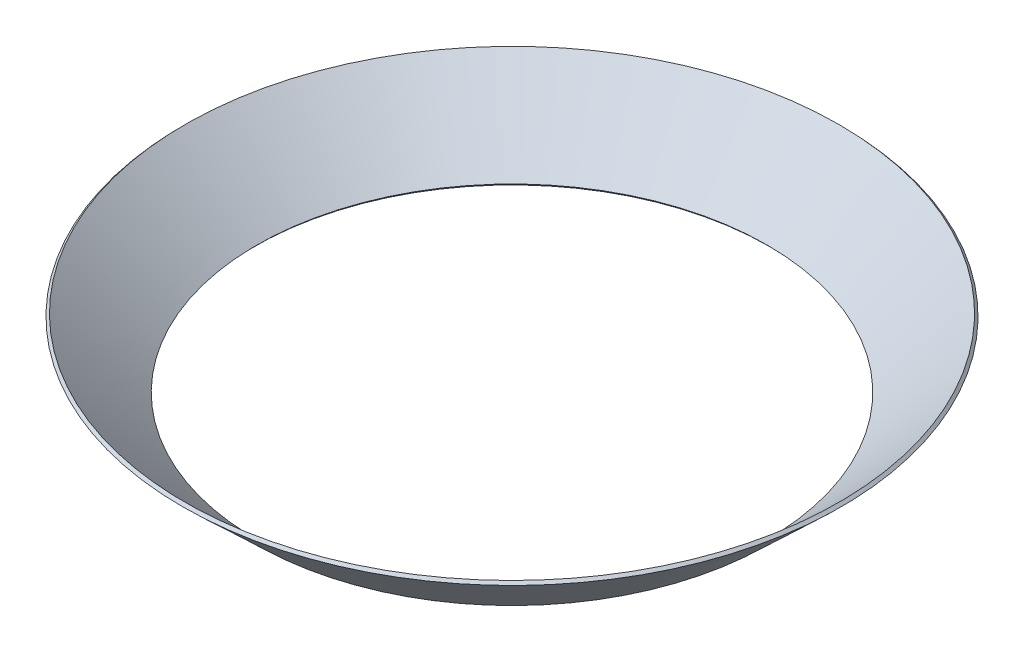
ISO-10303-21;
HEADER;
FILE_DESCRIPTION(('STEP AP214'),'2;1');
FILE_NAME('part.step','',(''),(''),'','','');
FILE_SCHEMA(('AUTOMOTIVE_DESIGN { 1 0 10303 214 1 1 1 1 }'));
ENDSEC;
DATA;
#1=APPLICATION_CONTEXT('core data for automotive mechanical design processes');
#2=APPLICATION_PROTOCOL_DEFINITION('international standard','automotive_design',2000,#1);
#3=PRODUCT_CONTEXT('',#1,'mechanical');
#4=PRODUCT('Part','Part','',(#3));
#5=PRODUCT_RELATED_PRODUCT_CATEGORY('part','',(#4));
#6=PRODUCT_DEFINITION_FORMATION('','',#4);
#7=PRODUCT_DEFINITION_CONTEXT('part definition',#1,'design');
#8=PRODUCT_DEFINITION('design','',#6,#7);
#9=PRODUCT_DEFINITION_SHAPE('','',#8);
#10=(LENGTH_UNIT() NAMED_UNIT(*) SI_UNIT(.MILLI.,.METRE.));
#11=(NAMED_UNIT(*) PLANE_ANGLE_UNIT() SI_UNIT($,.RADIAN.));
#12=(NAMED_UNIT(*) SI_UNIT($,.STERADIAN.) SOLID_ANGLE_UNIT());
#13=UNCERTAINTY_MEASURE_WITH_UNIT(LENGTH_MEASURE(1.E-05),#10,'distance_accuracy_value','');
#14=(GEOMETRIC_REPRESENTATION_CONTEXT(3) GLOBAL_UNCERTAINTY_ASSIGNED_CONTEXT((#13)) GLOBAL_UNIT_ASSIGNED_CONTEXT((#10,
#11,#12)) REPRESENTATION_CONTEXT('',''));
#15=CARTESIAN_POINT('',(0.,0.,0.));
#16=DIRECTION('',(0.,0.,1.));
#17=DIRECTION('',(1.,0.,0.));
#18=AXIS2_PLACEMENT_3D('',#15,#16,#17);
#19=CARTESIAN_POINT('',(0.,309.426421450919,1.08035657624089E-12));
#20=DIRECTION('',(0.,1.,0.));
#21=DIRECTION('',(0.,0.,1.));
#22=AXIS2_PLACEMENT_3D('',#19,#20,#21);
#23=CONICAL_SURFACE('',#22,36.0260738687479,0.811578102177003);
#24=CARTESIAN_POINT('',(0.,318.979376236805,1.11371053960663E-12));
#25=DIRECTION('',(0.,-1.,0.));
#26=DIRECTION('',(0.,0.,-1.));
#27=AXIS2_PLACEMENT_3D('',#24,#25,#26);
#28=CIRCLE('',#27,46.0927877598148);
#29=CARTESIAN_POINT('',(0.,318.979376236805,-46.0927877598137));
#30=VERTEX_POINT('',#29);
#31=EDGE_CURVE('E10',#30,#30,#28,.T.);
#32=ORIENTED_EDGE('',*,*,#31,.T.);
#33=EDGE_LOOP('',(#32));
#34=FACE_BOUND('',#33,.T.);
#35=CARTESIAN_POINT('',(0.,309.426421450919,1.08035657624089E-12));
#36=DIRECTION('',(0.,-1.,0.));
#37=DIRECTION('',(0.,0.,-1.));
#38=AXIS2_PLACEMENT_3D('',#35,#36,#37);
#39=CIRCLE('',#38,36.0260738687479);
#40=CARTESIAN_POINT('',(0.,309.426421450919,-36.0260738687468));
#41=VERTEX_POINT('',#40);
#42=EDGE_CURVE('E46',#41,#41,#39,.T.);
#43=ORIENTED_EDGE('',*,*,#42,.F.);
#44=EDGE_LOOP('',(#43));
#45=FACE_BOUND('',#44,.T.);
#46=ADVANCED_FACE('F32',(#34,#45),#23,.T.);
#47=CARTESIAN_POINT('',(0.,318.979376236805,1.11371053960663E-12));
#48=DIRECTION('',(0.,-1.,0.));
#49=DIRECTION('',(0.,0.,-1.));
#50=AXIS2_PLACEMENT_3D('',#47,#48,#49);
#51=CONICAL_SURFACE('',#50,46.0927877598148,0.759218224617544);
#52=CARTESIAN_POINT('',(0.,319.342063422311,1.11497685514666E-12));
#53=DIRECTION('',(0.,-1.,0.));
#54=DIRECTION('',(0.,0.,-1.));
#55=AXIS2_PLACEMENT_3D('',#52,#53,#54);
#56=CIRCLE('',#55,45.7486104719679);
#57=CARTESIAN_POINT('',(0.,319.342063422311,-45.7486104719668));
#58=VERTEX_POINT('',#57);
#59=EDGE_CURVE('E38',#58,#58,#56,.T.);
#60=ORIENTED_EDGE('',*,*,#59,.T.);
#61=EDGE_LOOP('',(#60));
#62=FACE_BOUND('',#61,.T.);
#63=ORIENTED_EDGE('',*,*,#31,.F.);
#64=EDGE_LOOP('',(#63));
#65=FACE_BOUND('',#64,.T.);
#66=ADVANCED_FACE('F56',(#62,#65),#51,.T.);
#67=CARTESIAN_POINT('',(0.,319.342063422311,1.11497685514666E-12));
#68=DIRECTION('',(0.,1.,0.));
#69=DIRECTION('',(0.,0.,1.));
#70=AXIS2_PLACEMENT_3D('',#67,#68,#69);
#71=CONICAL_SURFACE('',#70,45.7486104719679,0.811578102177004);
#72=CARTESIAN_POINT('',(0.,309.789108636425,1.08162289178093E-12));
#73=DIRECTION('',(0.,-1.,0.));
#74=DIRECTION('',(0.,0.,-1.));
#75=AXIS2_PLACEMENT_3D('',#72,#73,#74);
#76=CIRCLE('',#75,35.681896580901);
#77=CARTESIAN_POINT('',(0.,309.789108636425,-35.6818965808999));
#78=VERTEX_POINT('',#77);
#79=EDGE_CURVE('E42',#78,#78,#76,.T.);
#80=ORIENTED_EDGE('',*,*,#79,.T.);
#81=EDGE_LOOP('',(#80));
#82=FACE_BOUND('',#81,.T.);
#83=ORIENTED_EDGE('',*,*,#59,.F.);
#84=EDGE_LOOP('',(#83));
#85=FACE_BOUND('',#84,.T.);
#86=ADVANCED_FACE('F60',(#82,#85),#71,.F.);
#87=CARTESIAN_POINT('',(0.,309.789108636425,1.08162289178093E-12));
#88=DIRECTION('',(0.,-1.,0.));
#89=DIRECTION('',(0.,0.,-1.));
#90=AXIS2_PLACEMENT_3D('',#87,#88,#89);
#91=CONICAL_SURFACE('',#90,35.681896580901,0.759218224617584);
#92=ORIENTED_EDGE('',*,*,#42,.T.);
#93=EDGE_LOOP('',(#92));
#94=FACE_BOUND('',#93,.T.);
#95=ORIENTED_EDGE('',*,*,#79,.F.);
#96=EDGE_LOOP('',(#95));
#97=FACE_BOUND('',#96,.T.);
#98=ADVANCED_FACE('F52',(#94,#97),#91,.F.);
#99=CLOSED_SHELL('',(#46,#66,#86,#98));
#100=MANIFOLD_SOLID_BREP('B2',#99);
#101=ADVANCED_BREP_SHAPE_REPRESENTATION('',(#18,#100),#14);
#102=SHAPE_DEFINITION_REPRESENTATION(#9,#101);
ENDSEC;
END-ISO-10303-21;
